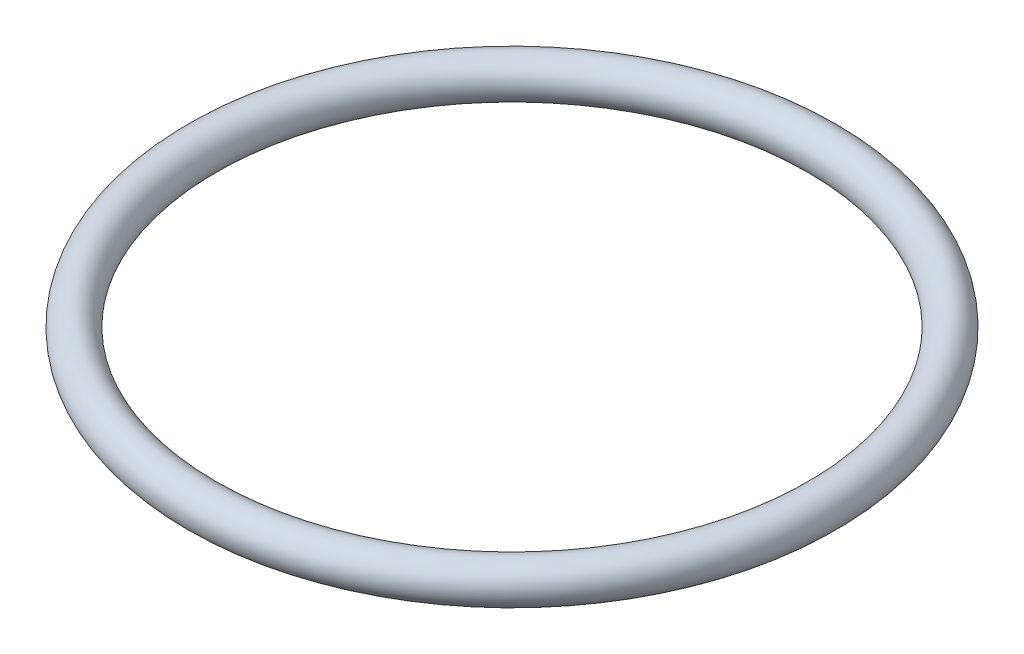
ISO-10303-21;
HEADER;
FILE_DESCRIPTION(('STEP AP214'),'2;1');
FILE_NAME('part.step','',(''),(''),'','','');
FILE_SCHEMA(('AUTOMOTIVE_DESIGN { 1 0 10303 214 1 1 1 1 }'));
ENDSEC;
DATA;
#1=APPLICATION_CONTEXT('core data for automotive mechanical design processes');
#2=APPLICATION_PROTOCOL_DEFINITION('international standard','automotive_design',2000,#1);
#3=PRODUCT_CONTEXT('',#1,'mechanical');
#4=PRODUCT('Part','Part','',(#3));
#5=PRODUCT_RELATED_PRODUCT_CATEGORY('part','',(#4));
#6=PRODUCT_DEFINITION_FORMATION('','',#4);
#7=PRODUCT_DEFINITION_CONTEXT('part definition',#1,'design');
#8=PRODUCT_DEFINITION('design','',#6,#7);
#9=PRODUCT_DEFINITION_SHAPE('','',#8);
#10=(LENGTH_UNIT() NAMED_UNIT(*) SI_UNIT(.MILLI.,.METRE.));
#11=(NAMED_UNIT(*) PLANE_ANGLE_UNIT() SI_UNIT($,.RADIAN.));
#12=(NAMED_UNIT(*) SI_UNIT($,.STERADIAN.) SOLID_ANGLE_UNIT());
#13=UNCERTAINTY_MEASURE_WITH_UNIT(LENGTH_MEASURE(1.E-05),#10,'distance_accuracy_value','');
#14=(GEOMETRIC_REPRESENTATION_CONTEXT(3) GLOBAL_UNCERTAINTY_ASSIGNED_CONTEXT((#13)) GLOBAL_UNIT_ASSIGNED_CONTEXT((#10,
#11,#12)) REPRESENTATION_CONTEXT('',''));
#15=CARTESIAN_POINT('',(0.,0.,0.));
#16=DIRECTION('',(0.,0.,1.));
#17=DIRECTION('',(1.,0.,0.));
#18=AXIS2_PLACEMENT_3D('',#15,#16,#17);
#19=CARTESIAN_POINT('',(0.,0.,0.));
#20=DIRECTION('',(0.,-1.,0.));
#21=DIRECTION('',(0.,0.,-1.));
#22=AXIS2_PLACEMENT_3D('',#19,#20,#21);
#23=TOROIDAL_SURFACE('',#22,23.5,1.5);
#24=CARTESIAN_POINT('',(0.,0.,-25.));
#25=VERTEX_POINT('',#24);
#26=VERTEX_LOOP('',#25);
#27=FACE_BOUND('',#26,.T.);
#28=ADVANCED_FACE('F33',(#27),#23,.T.);
#29=CLOSED_SHELL('',(#28));
#30=MANIFOLD_SOLID_BREP('B2',#29);
#31=ADVANCED_BREP_SHAPE_REPRESENTATION('',(#18,#30),#14);
#32=SHAPE_DEFINITION_REPRESENTATION(#9,#31);
ENDSEC;
END-ISO-10303-21;
